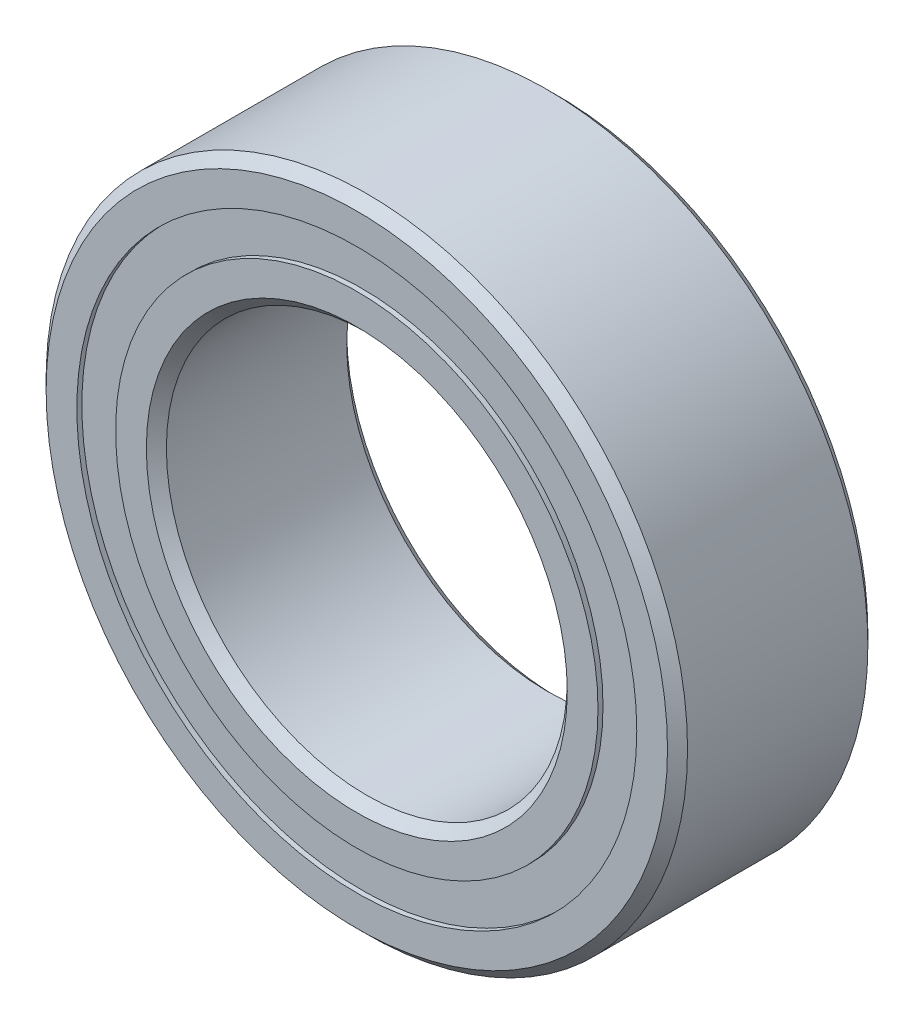
ISO-10303-21;
HEADER;
FILE_DESCRIPTION(('STEP AP214'),'2;1');
FILE_NAME('part.step','',(''),(''),'','','');
FILE_SCHEMA(('AUTOMOTIVE_DESIGN { 1 0 10303 214 1 1 1 1 }'));
ENDSEC;
DATA;
#1=APPLICATION_CONTEXT('core data for automotive mechanical design processes');
#2=APPLICATION_PROTOCOL_DEFINITION('international standard','automotive_design',2000,#1);
#3=PRODUCT_CONTEXT('',#1,'mechanical');
#4=PRODUCT('Part','Part','',(#3));
#5=PRODUCT_RELATED_PRODUCT_CATEGORY('part','',(#4));
#6=PRODUCT_DEFINITION_FORMATION('','',#4);
#7=PRODUCT_DEFINITION_CONTEXT('part definition',#1,'design');
#8=PRODUCT_DEFINITION('design','',#6,#7);
#9=PRODUCT_DEFINITION_SHAPE('','',#8);
#10=(LENGTH_UNIT() NAMED_UNIT(*) SI_UNIT(.MILLI.,.METRE.));
#11=(NAMED_UNIT(*) PLANE_ANGLE_UNIT() SI_UNIT($,.RADIAN.));
#12=(NAMED_UNIT(*) SI_UNIT($,.STERADIAN.) SOLID_ANGLE_UNIT());
#13=UNCERTAINTY_MEASURE_WITH_UNIT(LENGTH_MEASURE(1.E-05),#10,'distance_accuracy_value','');
#14=(GEOMETRIC_REPRESENTATION_CONTEXT(3) GLOBAL_UNCERTAINTY_ASSIGNED_CONTEXT((#13)) GLOBAL_UNIT_ASSIGNED_CONTEXT((#10,
#11,#12)) REPRESENTATION_CONTEXT('',''));
#15=CARTESIAN_POINT('',(0.,0.,0.));
#16=DIRECTION('',(0.,0.,1.));
#17=DIRECTION('',(1.,0.,0.));
#18=AXIS2_PLACEMENT_3D('',#15,#16,#17);
#19=CARTESIAN_POINT('',(0.,5.54322203296703,-1.884553));
#20=DIRECTION('',(0.,0.,1.));
#21=DIRECTION('',(1.,0.,0.));
#22=AXIS2_PLACEMENT_3D('',#19,#20,#21);
#23=PLANE('',#22);
#24=CARTESIAN_POINT('',(0.,0.,-1.884553));
#25=DIRECTION('',(0.,0.,1.));
#26=DIRECTION('',(1.,0.,0.));
#27=AXIS2_PLACEMENT_3D('',#24,#25,#26);
#28=CIRCLE('',#27,5.54322203296703);
#29=CARTESIAN_POINT('',(5.54322203296703,0.,-1.884553));
#30=VERTEX_POINT('',#29);
#31=EDGE_CURVE('E55',#30,#30,#28,.T.);
#32=ORIENTED_EDGE('',*,*,#31,.F.);
#33=EDGE_LOOP('',(#32));
#34=FACE_BOUND('',#33,.T.);
#35=CARTESIAN_POINT('',(0.,0.,-1.884553));
#36=DIRECTION('',(0.,0.,1.));
#37=DIRECTION('',(1.,0.,0.));
#38=AXIS2_PLACEMENT_3D('',#35,#36,#37);
#39=CIRCLE('',#38,4.77552796703297);
#40=CARTESIAN_POINT('',(4.77552796703297,0.,-1.884553));
#41=VERTEX_POINT('',#40);
#42=EDGE_CURVE('E11',#41,#41,#39,.T.);
#43=ORIENTED_EDGE('',*,*,#42,.T.);
#44=EDGE_LOOP('',(#43));
#45=FACE_BOUND('',#44,.T.);
#46=ADVANCED_FACE('F41',(#34,#45),#23,.F.);
#47=CARTESIAN_POINT('',(0.,0.,1.98374));
#48=DIRECTION('',(0.,0.,1.));
#49=DIRECTION('',(1.,0.,0.));
#50=AXIS2_PLACEMENT_3D('',#47,#48,#49);
#51=CYLINDRICAL_SURFACE('',#50,4.77552796703297);
#52=ORIENTED_EDGE('',*,*,#42,.F.);
#53=EDGE_LOOP('',(#52));
#54=FACE_BOUND('',#53,.T.);
#55=CARTESIAN_POINT('',(0.,0.,-0.961595974831125));
#56=DIRECTION('',(0.,0.,1.));
#57=DIRECTION('',(1.,0.,0.));
#58=AXIS2_PLACEMENT_3D('',#55,#56,#57);
#59=CIRCLE('',#58,4.77552796703297);
#60=CARTESIAN_POINT('',(4.77552796703297,0.,-0.961595974831125));
#61=VERTEX_POINT('',#60);
#62=EDGE_CURVE('E47',#61,#61,#59,.T.);
#63=ORIENTED_EDGE('',*,*,#62,.T.);
#64=EDGE_LOOP('',(#63));
#65=FACE_BOUND('',#64,.T.);
#66=ADVANCED_FACE('F64',(#54,#65),#51,.F.);
#67=CARTESIAN_POINT('',(0.,5.54322203296703,-0.961595974831125));
#68=DIRECTION('',(0.,0.,-1.));
#69=DIRECTION('',(-1.,0.,0.));
#70=AXIS2_PLACEMENT_3D('',#67,#68,#69);
#71=PLANE('',#70);
#72=ORIENTED_EDGE('',*,*,#62,.F.);
#73=EDGE_LOOP('',(#72));
#74=FACE_BOUND('',#73,.T.);
#75=CARTESIAN_POINT('',(0.,0.,-0.961595974831125));
#76=DIRECTION('',(0.,0.,1.));
#77=DIRECTION('',(1.,0.,0.));
#78=AXIS2_PLACEMENT_3D('',#75,#76,#77);
#79=CIRCLE('',#78,5.54322203296703);
#80=CARTESIAN_POINT('',(5.54322203296703,0.,-0.961595974831125));
#81=VERTEX_POINT('',#80);
#82=EDGE_CURVE('E51',#81,#81,#79,.T.);
#83=ORIENTED_EDGE('',*,*,#82,.T.);
#84=EDGE_LOOP('',(#83));
#85=FACE_BOUND('',#84,.T.);
#86=ADVANCED_FACE('F68',(#74,#85),#71,.F.);
#87=CARTESIAN_POINT('',(0.,0.,1.98374));
#88=DIRECTION('',(0.,0.,1.));
#89=DIRECTION('',(1.,0.,0.));
#90=AXIS2_PLACEMENT_3D('',#87,#88,#89);
#91=CYLINDRICAL_SURFACE('',#90,5.54322203296703);
#92=ORIENTED_EDGE('',*,*,#82,.F.);
#93=EDGE_LOOP('',(#92));
#94=FACE_BOUND('',#93,.T.);
#95=ORIENTED_EDGE('',*,*,#31,.T.);
#96=EDGE_LOOP('',(#95));
#97=FACE_BOUND('',#96,.T.);
#98=ADVANCED_FACE('F61',(#94,#97),#91,.T.);
#99=CLOSED_SHELL('',(#46,#66,#86,#98));
#100=MANIFOLD_SOLID_BREP('B2',#99);
#101=CARTESIAN_POINT('',(0.,5.54322203296703,1.884553));
#102=DIRECTION('',(0.,0.,-1.));
#103=DIRECTION('',(-1.,0.,0.));
#104=AXIS2_PLACEMENT_3D('',#101,#102,#103);
#105=PLANE('',#104);
#106=CARTESIAN_POINT('',(0.,0.,1.884553));
#107=DIRECTION('',(0.,0.,1.));
#108=DIRECTION('',(1.,0.,0.));
#109=AXIS2_PLACEMENT_3D('',#106,#107,#108);
#110=CIRCLE('',#109,4.77552796703297);
#111=CARTESIAN_POINT('',(4.77552796703297,0.,1.884553));
#112=VERTEX_POINT('',#111);
#113=EDGE_CURVE('E40',#112,#112,#110,.T.);
#114=ORIENTED_EDGE('',*,*,#113,.F.);
#115=EDGE_LOOP('',(#114));
#116=FACE_BOUND('',#115,.T.);
#117=CARTESIAN_POINT('',(0.,0.,1.884553));
#118=DIRECTION('',(0.,0.,1.));
#119=DIRECTION('',(1.,0.,0.));
#120=AXIS2_PLACEMENT_3D('',#117,#118,#119);
#121=CIRCLE('',#120,5.54322203296703);
#122=CARTESIAN_POINT('',(5.54322203296703,0.,1.884553));
#123=VERTEX_POINT('',#122);
#124=EDGE_CURVE('E122',#123,#123,#121,.T.);
#125=ORIENTED_EDGE('',*,*,#124,.T.);
#126=EDGE_LOOP('',(#125));
#127=FACE_BOUND('',#126,.T.);
#128=ADVANCED_FACE('F108',(#116,#127),#105,.F.);
#129=CARTESIAN_POINT('',(0.,0.,1.98374));
#130=DIRECTION('',(0.,0.,1.));
#131=DIRECTION('',(1.,0.,0.));
#132=AXIS2_PLACEMENT_3D('',#129,#130,#131);
#133=CYLINDRICAL_SURFACE('',#132,4.77552796703297);
#134=CARTESIAN_POINT('',(0.,0.,0.961595974831124));
#135=DIRECTION('',(0.,0.,1.));
#136=DIRECTION('',(1.,0.,0.));
#137=AXIS2_PLACEMENT_3D('',#134,#135,#136);
#138=CIRCLE('',#137,4.77552796703297);
#139=CARTESIAN_POINT('',(4.77552796703297,0.,0.961595974831124));
#140=VERTEX_POINT('',#139);
#141=EDGE_CURVE('E114',#140,#140,#138,.T.);
#142=ORIENTED_EDGE('',*,*,#141,.F.);
#143=EDGE_LOOP('',(#142));
#144=FACE_BOUND('',#143,.T.);
#145=ORIENTED_EDGE('',*,*,#113,.T.);
#146=EDGE_LOOP('',(#145));
#147=FACE_BOUND('',#146,.T.);
#148=ADVANCED_FACE('F137',(#144,#147),#133,.F.);
#149=CARTESIAN_POINT('',(0.,5.54322203296703,0.961595974831124));
#150=DIRECTION('',(0.,0.,1.));
#151=DIRECTION('',(1.,0.,0.));
#152=AXIS2_PLACEMENT_3D('',#149,#150,#151);
#153=PLANE('',#152);
#154=CARTESIAN_POINT('',(0.,0.,0.961595974831124));
#155=DIRECTION('',(0.,0.,1.));
#156=DIRECTION('',(1.,0.,0.));
#157=AXIS2_PLACEMENT_3D('',#154,#155,#156);
#158=CIRCLE('',#157,5.54322203296703);
#159=CARTESIAN_POINT('',(5.54322203296703,0.,0.961595974831124));
#160=VERTEX_POINT('',#159);
#161=EDGE_CURVE('E118',#160,#160,#158,.T.);
#162=ORIENTED_EDGE('',*,*,#161,.F.);
#163=EDGE_LOOP('',(#162));
#164=FACE_BOUND('',#163,.T.);
#165=ORIENTED_EDGE('',*,*,#141,.T.);
#166=EDGE_LOOP('',(#165));
#167=FACE_BOUND('',#166,.T.);
#168=ADVANCED_FACE('F132',(#164,#167),#153,.F.);
#169=CARTESIAN_POINT('',(0.,0.,1.98374));
#170=DIRECTION('',(0.,0.,1.));
#171=DIRECTION('',(1.,0.,0.));
#172=AXIS2_PLACEMENT_3D('',#169,#170,#171);
#173=CYLINDRICAL_SURFACE('',#172,5.54322203296703);
#174=ORIENTED_EDGE('',*,*,#124,.F.);
#175=EDGE_LOOP('',(#174));
#176=FACE_BOUND('',#175,.T.);
#177=ORIENTED_EDGE('',*,*,#161,.T.);
#178=EDGE_LOOP('',(#177));
#179=FACE_BOUND('',#178,.T.);
#180=ADVANCED_FACE('F129',(#176,#179),#173,.T.);
#181=CLOSED_SHELL('',(#128,#148,#168,#180));
#182=MANIFOLD_SOLID_BREP('B6',#181);
#183=CARTESIAN_POINT('',(-1.97440733385857,4.76664096305045,0.));
#184=DIRECTION('',(0.,0.,1.));
#185=DIRECTION('',(0.382683432365077,-0.923879532511292,0.));
#186=AXIS2_PLACEMENT_3D('',#183,#184,#185);
#187=SPHERICAL_SURFACE('',#186,0.961595974831125);
#188=CARTESIAN_POINT('',(-1.97440733385857,4.76664096305045,0.961595974831125));
#189=VERTEX_POINT('',#188);
#190=VERTEX_LOOP('',#189);
#191=FACE_BOUND('',#190,.T.);
#192=ADVANCED_FACE('F175',(#191),#187,.T.);
#193=CLOSED_SHELL('',(#192));
#194=MANIFOLD_SOLID_BREP('B35',#193);
#195=CARTESIAN_POINT('',(-3.6482290491843,3.64822904918439,0.));
#196=DIRECTION('',(0.,0.,1.));
#197=DIRECTION('',(0.707106781186539,-0.707106781186556,0.));
#198=AXIS2_PLACEMENT_3D('',#195,#196,#197);
#199=SPHERICAL_SURFACE('',#198,0.961595974831125);
#200=CARTESIAN_POINT('',(-3.6482290491843,3.64822904918439,0.961595974831125));
#201=VERTEX_POINT('',#200);
#202=VERTEX_LOOP('',#201);
#203=FACE_BOUND('',#202,.T.);
#204=ADVANCED_FACE('F195',(#203),#199,.T.);
#205=CLOSED_SHELL('',(#204));
#206=MANIFOLD_SOLID_BREP('B104',#205);
#207=CARTESIAN_POINT('',(-4.7666409630504,1.97440733385869,0.));
#208=DIRECTION('',(0.,0.,1.));
#209=DIRECTION('',(0.923879532511283,-0.3826834323651,0.));
#210=AXIS2_PLACEMENT_3D('',#207,#208,#209);
#211=SPHERICAL_SURFACE('',#210,0.961595974831125);
#212=CARTESIAN_POINT('',(-4.7666409630504,1.97440733385869,0.961595974831125));
#213=VERTEX_POINT('',#212);
#214=VERTEX_LOOP('',#213);
#215=FACE_BOUND('',#214,.T.);
#216=ADVANCED_FACE('F215',(#215),#211,.T.);
#217=CLOSED_SHELL('',(#216));
#218=MANIFOLD_SOLID_BREP('B171',#217);
#219=CARTESIAN_POINT('',(-5.159375,0.,0.));
#220=DIRECTION('',(0.,0.,1.));
#221=DIRECTION('',(1.,0.,0.));
#222=AXIS2_PLACEMENT_3D('',#219,#220,#221);
#223=SPHERICAL_SURFACE('',#222,0.961595974831125);
#224=CARTESIAN_POINT('',(-5.159375,0.,0.961595974831125));
#225=VERTEX_POINT('',#224);
#226=VERTEX_LOOP('',#225);
#227=FACE_BOUND('',#226,.T.);
#228=ADVANCED_FACE('F235',(#227),#223,.T.);
#229=CLOSED_SHELL('',(#228));
#230=MANIFOLD_SOLID_BREP('B191',#229);
#231=CARTESIAN_POINT('',(-4.76664096305044,-1.97440733385859,0.));
#232=DIRECTION('',(0.,0.,1.));
#233=DIRECTION('',(0.923879532511291,0.382683432365081,0.));
#234=AXIS2_PLACEMENT_3D('',#231,#232,#233);
#235=SPHERICAL_SURFACE('',#234,0.961595974831125);
#236=CARTESIAN_POINT('',(-4.76664096305044,-1.97440733385859,0.961595974831125));
#237=VERTEX_POINT('',#236);
#238=VERTEX_LOOP('',#237);
#239=FACE_BOUND('',#238,.T.);
#240=ADVANCED_FACE('F255',(#239),#235,.T.);
#241=CLOSED_SHELL('',(#240));
#242=MANIFOLD_SOLID_BREP('B211',#241);
#243=CARTESIAN_POINT('',(-3.64822904918437,-3.64822904918431,0.));
#244=DIRECTION('',(0.,0.,1.));
#245=DIRECTION('',(0.707106781186554,0.707106781186541,0.));
#246=AXIS2_PLACEMENT_3D('',#243,#244,#245);
#247=SPHERICAL_SURFACE('',#246,0.961595974831125);
#248=CARTESIAN_POINT('',(-3.64822904918437,-3.64822904918431,0.961595974831125));
#249=VERTEX_POINT('',#248);
#250=VERTEX_LOOP('',#249);
#251=FACE_BOUND('',#250,.T.);
#252=ADVANCED_FACE('F275',(#251),#247,.T.);
#253=CLOSED_SHELL('',(#252));
#254=MANIFOLD_SOLID_BREP('B231',#253);
#255=CARTESIAN_POINT('',(-1.97440733385867,-4.7666409630504,0.));
#256=DIRECTION('',(0.,0.,1.));
#257=DIRECTION('',(0.382683432365097,0.923879532511284,0.));
#258=AXIS2_PLACEMENT_3D('',#255,#256,#257);
#259=SPHERICAL_SURFACE('',#258,0.961595974831125);
#260=CARTESIAN_POINT('',(-1.97440733385867,-4.7666409630504,0.961595974831125));
#261=VERTEX_POINT('',#260);
#262=VERTEX_LOOP('',#261);
#263=FACE_BOUND('',#262,.T.);
#264=ADVANCED_FACE('F295',(#263),#259,.T.);
#265=CLOSED_SHELL('',(#264));
#266=MANIFOLD_SOLID_BREP('B251',#265);
#267=CARTESIAN_POINT('',(0.,-5.159375,0.));
#268=DIRECTION('',(0.,0.,1.));
#269=DIRECTION('',(0.,1.,0.));
#270=AXIS2_PLACEMENT_3D('',#267,#268,#269);
#271=SPHERICAL_SURFACE('',#270,0.961595974831125);
#272=CARTESIAN_POINT('',(0.,-5.159375,0.961595974831125));
#273=VERTEX_POINT('',#272);
#274=VERTEX_LOOP('',#273);
#275=FACE_BOUND('',#274,.T.);
#276=ADVANCED_FACE('F315',(#275),#271,.T.);
#277=CLOSED_SHELL('',(#276));
#278=MANIFOLD_SOLID_BREP('B271',#277);
#279=CARTESIAN_POINT('',(1.97440733385861,-4.76664096305043,0.));
#280=DIRECTION('',(0.,0.,1.));
#281=DIRECTION('',(-0.382683432365084,0.923879532511289,0.));
#282=AXIS2_PLACEMENT_3D('',#279,#280,#281);
#283=SPHERICAL_SURFACE('',#282,0.961595974831125);
#284=CARTESIAN_POINT('',(1.97440733385861,-4.76664096305043,0.961595974831125));
#285=VERTEX_POINT('',#284);
#286=VERTEX_LOOP('',#285);
#287=FACE_BOUND('',#286,.T.);
#288=ADVANCED_FACE('F335',(#287),#283,.T.);
#289=CLOSED_SHELL('',(#288));
#290=MANIFOLD_SOLID_BREP('B291',#289);
#291=CARTESIAN_POINT('',(3.64822904918432,-3.64822904918436,0.));
#292=DIRECTION('',(0.,0.,1.));
#293=DIRECTION('',(-0.707106781186544,0.707106781186551,0.));
#294=AXIS2_PLACEMENT_3D('',#291,#292,#293);
#295=SPHERICAL_SURFACE('',#294,0.961595974831125);
#296=CARTESIAN_POINT('',(3.64822904918432,-3.64822904918436,0.961595974831125));
#297=VERTEX_POINT('',#296);
#298=VERTEX_LOOP('',#297);
#299=FACE_BOUND('',#298,.T.);
#300=ADVANCED_FACE('F355',(#299),#295,.T.);
#301=CLOSED_SHELL('',(#300));
#302=MANIFOLD_SOLID_BREP('B311',#301);
#303=CARTESIAN_POINT('',(4.76664096305041,-1.97440733385866,0.));
#304=DIRECTION('',(0.,0.,1.));
#305=DIRECTION('',(-0.923879532511285,0.382683432365094,0.));
#306=AXIS2_PLACEMENT_3D('',#303,#304,#305);
#307=SPHERICAL_SURFACE('',#306,0.961595974831125);
#308=CARTESIAN_POINT('',(4.76664096305041,-1.97440733385866,0.961595974831125));
#309=VERTEX_POINT('',#308);
#310=VERTEX_LOOP('',#309);
#311=FACE_BOUND('',#310,.T.);
#312=ADVANCED_FACE('F375',(#311),#307,.T.);
#313=CLOSED_SHELL('',(#312));
#314=MANIFOLD_SOLID_BREP('B331',#313);
#315=CARTESIAN_POINT('',(5.159375,0.,0.));
#316=DIRECTION('',(0.,0.,1.));
#317=DIRECTION('',(-1.,0.,0.));
#318=AXIS2_PLACEMENT_3D('',#315,#316,#317);
#319=SPHERICAL_SURFACE('',#318,0.961595974831125);
#320=CARTESIAN_POINT('',(5.159375,0.,0.961595974831125));
#321=VERTEX_POINT('',#320);
#322=VERTEX_LOOP('',#321);
#323=FACE_BOUND('',#322,.T.);
#324=ADVANCED_FACE('F395',(#323),#319,.T.);
#325=CLOSED_SHELL('',(#324));
#326=MANIFOLD_SOLID_BREP('B351',#325);
#327=CARTESIAN_POINT('',(4.76664096305042,1.97440733385862,0.));
#328=DIRECTION('',(0.,0.,1.));
#329=DIRECTION('',(-0.923879532511288,-0.382683432365087,0.));
#330=AXIS2_PLACEMENT_3D('',#327,#328,#329);
#331=SPHERICAL_SURFACE('',#330,0.961595974831125);
#332=CARTESIAN_POINT('',(4.76664096305042,1.97440733385862,0.961595974831125));
#333=VERTEX_POINT('',#332);
#334=VERTEX_LOOP('',#333);
#335=FACE_BOUND('',#334,.T.);
#336=ADVANCED_FACE('F415',(#335),#331,.T.);
#337=CLOSED_SHELL('',(#336));
#338=MANIFOLD_SOLID_BREP('B371',#337);
#339=CARTESIAN_POINT('',(3.64822904918435,3.64822904918434,0.));
#340=DIRECTION('',(0.,0.,1.));
#341=DIRECTION('',(-0.707106781186549,-0.707106781186546,0.));
#342=AXIS2_PLACEMENT_3D('',#339,#340,#341);
#343=SPHERICAL_SURFACE('',#342,0.961595974831125);
#344=CARTESIAN_POINT('',(3.64822904918435,3.64822904918434,0.961595974831125));
#345=VERTEX_POINT('',#344);
#346=VERTEX_LOOP('',#345);
#347=FACE_BOUND('',#346,.T.);
#348=ADVANCED_FACE('F435',(#347),#343,.T.);
#349=CLOSED_SHELL('',(#348));
#350=MANIFOLD_SOLID_BREP('B391',#349);
#351=CARTESIAN_POINT('',(1.97440733385864,4.76664096305042,0.));
#352=DIRECTION('',(0.,0.,1.));
#353=DIRECTION('',(-0.382683432365091,-0.923879532511287,0.));
#354=AXIS2_PLACEMENT_3D('',#351,#352,#353);
#355=SPHERICAL_SURFACE('',#354,0.961595974831125);
#356=CARTESIAN_POINT('',(1.97440733385864,4.76664096305042,0.961595974831125));
#357=VERTEX_POINT('',#356);
#358=VERTEX_LOOP('',#357);
#359=FACE_BOUND('',#358,.T.);
#360=ADVANCED_FACE('F455',(#359),#355,.T.);
#361=CLOSED_SHELL('',(#360));
#362=MANIFOLD_SOLID_BREP('B411',#361);
#363=CARTESIAN_POINT('',(0.,5.159375,0.));
#364=DIRECTION('',(0.,0.,1.));
#365=DIRECTION('',(0.,-1.,0.));
#366=AXIS2_PLACEMENT_3D('',#363,#364,#365);
#367=SPHERICAL_SURFACE('',#366,0.961595974831125);
#368=CARTESIAN_POINT('',(0.,5.159375,0.961595974831125));
#369=VERTEX_POINT('',#368);
#370=VERTEX_LOOP('',#369);
#371=FACE_BOUND('',#370,.T.);
#372=ADVANCED_FACE('F477',(#371),#367,.T.);
#373=CLOSED_SHELL('',(#372));
#374=MANIFOLD_SOLID_BREP('B431',#373);
#375=CARTESIAN_POINT('',(0.,4.77552796703297,1.98374));
#376=DIRECTION('',(0.,0.,-1.));
#377=DIRECTION('',(-1.,0.,0.));
#378=AXIS2_PLACEMENT_3D('',#375,#376,#377);
#379=PLANE('',#378);
#380=CARTESIAN_POINT('',(0.,0.,1.98374));
#381=DIRECTION('',(0.,0.,1.));
#382=DIRECTION('',(1.,0.,0.));
#383=AXIS2_PLACEMENT_3D('',#380,#381,#382);
#384=CIRCLE('',#383,4.167124);
#385=CARTESIAN_POINT('',(4.167124,0.,1.98374));
#386=VERTEX_POINT('',#385);
#387=EDGE_CURVE('E524',#386,#386,#384,.T.);
#388=ORIENTED_EDGE('',*,*,#387,.F.);
#389=EDGE_LOOP('',(#388));
#390=FACE_BOUND('',#389,.T.);
#391=CARTESIAN_POINT('',(0.,0.,1.98374));
#392=DIRECTION('',(0.,0.,1.));
#393=DIRECTION('',(1.,0.,0.));
#394=AXIS2_PLACEMENT_3D('',#391,#392,#393);
#395=CIRCLE('',#394,4.77552796703297);
#396=CARTESIAN_POINT('',(4.77552796703297,0.,1.98374));
#397=VERTEX_POINT('',#396);
#398=EDGE_CURVE('E476',#397,#397,#395,.T.);
#399=ORIENTED_EDGE('',*,*,#398,.T.);
#400=EDGE_LOOP('',(#399));
#401=FACE_BOUND('',#400,.T.);
#402=ADVANCED_FACE('F496',(#390,#401),#379,.F.);
#403=CARTESIAN_POINT('',(0.,0.,1.98374));
#404=DIRECTION('',(0.,0.,1.));
#405=DIRECTION('',(1.,0.,0.));
#406=AXIS2_PLACEMENT_3D('',#403,#404,#405);
#407=CYLINDRICAL_SURFACE('',#406,4.77552796703297);
#408=ORIENTED_EDGE('',*,*,#398,.F.);
#409=EDGE_LOOP('',(#408));
#410=FACE_BOUND('',#409,.T.);
#411=CARTESIAN_POINT('',(0.,0.,0.881662222222222));
#412=DIRECTION('',(0.,0.,1.));
#413=DIRECTION('',(1.,0.,0.));
#414=AXIS2_PLACEMENT_3D('',#411,#412,#413);
#415=CIRCLE('',#414,4.77552796703297);
#416=CARTESIAN_POINT('',(4.77552796703297,0.,0.881662222222222));
#417=VERTEX_POINT('',#416);
#418=EDGE_CURVE('E502',#417,#417,#415,.T.);
#419=ORIENTED_EDGE('',*,*,#418,.T.);
#420=EDGE_LOOP('',(#419));
#421=FACE_BOUND('',#420,.T.);
#422=ADVANCED_FACE('F531',(#410,#421),#407,.T.);
#423=CARTESIAN_POINT('',(0.,0.,0.));
#424=DIRECTION('',(0.,0.,1.));
#425=DIRECTION('',(1.,0.,0.));
#426=AXIS2_PLACEMENT_3D('',#423,#424,#425);
#427=TOROIDAL_SURFACE('',#426,5.15937499999999,0.961595974831123);
#428=ORIENTED_EDGE('',*,*,#418,.F.);
#429=EDGE_LOOP('',(#428));
#430=FACE_BOUND('',#429,.T.);
#431=CARTESIAN_POINT('',(0.,0.,-0.881662222222224));
#432=DIRECTION('',(0.,0.,1.));
#433=DIRECTION('',(1.,0.,0.));
#434=AXIS2_PLACEMENT_3D('',#431,#432,#433);
#435=CIRCLE('',#434,4.77552796703297);
#436=CARTESIAN_POINT('',(4.77552796703297,0.,-0.881662222222224));
#437=VERTEX_POINT('',#436);
#438=EDGE_CURVE('E506',#437,#437,#435,.T.);
#439=ORIENTED_EDGE('',*,*,#438,.T.);
#440=EDGE_LOOP('',(#439));
#441=FACE_BOUND('',#440,.T.);
#442=ADVANCED_FACE('F535',(#430,#441),#427,.F.);
#443=CARTESIAN_POINT('',(0.,0.,1.98374));
#444=DIRECTION('',(0.,0.,1.));
#445=DIRECTION('',(1.,0.,0.));
#446=AXIS2_PLACEMENT_3D('',#443,#444,#445);
#447=CYLINDRICAL_SURFACE('',#446,4.77552796703297);
#448=ORIENTED_EDGE('',*,*,#438,.F.);
#449=EDGE_LOOP('',(#448));
#450=FACE_BOUND('',#449,.T.);
#451=CARTESIAN_POINT('',(0.,0.,-1.98374));
#452=DIRECTION('',(0.,0.,1.));
#453=DIRECTION('',(1.,0.,0.));
#454=AXIS2_PLACEMENT_3D('',#451,#452,#453);
#455=CIRCLE('',#454,4.77552796703297);
#456=CARTESIAN_POINT('',(4.77552796703297,0.,-1.98374));
#457=VERTEX_POINT('',#456);
#458=EDGE_CURVE('E510',#457,#457,#455,.T.);
#459=ORIENTED_EDGE('',*,*,#458,.T.);
#460=EDGE_LOOP('',(#459));
#461=FACE_BOUND('',#460,.T.);
#462=ADVANCED_FACE('F540',(#450,#461),#447,.T.);
#463=CARTESIAN_POINT('',(0.,4.167124,-1.98374));
#464=DIRECTION('',(0.,0.,1.));
#465=DIRECTION('',(1.,0.,0.));
#466=AXIS2_PLACEMENT_3D('',#463,#464,#465);
#467=PLANE('',#466);
#468=ORIENTED_EDGE('',*,*,#458,.F.);
#469=EDGE_LOOP('',(#468));
#470=FACE_BOUND('',#469,.T.);
#471=CARTESIAN_POINT('',(0.,0.,-1.98374));
#472=DIRECTION('',(0.,0.,1.));
#473=DIRECTION('',(1.,0.,0.));
#474=AXIS2_PLACEMENT_3D('',#471,#472,#473);
#475=CIRCLE('',#474,4.167124);
#476=CARTESIAN_POINT('',(4.167124,0.,-1.98374));
#477=VERTEX_POINT('',#476);
#478=EDGE_CURVE('E515',#477,#477,#475,.T.);
#479=ORIENTED_EDGE('',*,*,#478,.T.);
#480=EDGE_LOOP('',(#479));
#481=FACE_BOUND('',#480,.T.);
#482=ADVANCED_FACE('F546',(#470,#481),#467,.F.);
#483=CARTESIAN_POINT('',(0.,0.,-1.785366));
#484=DIRECTION('',(0.,0.,-1.));
#485=DIRECTION('',(-1.,0.,0.));
#486=AXIS2_PLACEMENT_3D('',#483,#484,#485);
#487=CONICAL_SURFACE('',#486,3.96875,0.785398163397448);
#488=ORIENTED_EDGE('',*,*,#478,.F.);
#489=EDGE_LOOP('',(#488));
#490=FACE_BOUND('',#489,.T.);
#491=CARTESIAN_POINT('',(0.,0.,-1.785366));
#492=DIRECTION('',(0.,0.,1.));
#493=DIRECTION('',(1.,0.,0.));
#494=AXIS2_PLACEMENT_3D('',#491,#492,#493);
#495=CIRCLE('',#494,3.96875);
#496=CARTESIAN_POINT('',(3.96875,0.,-1.785366));
#497=VERTEX_POINT('',#496);
#498=EDGE_CURVE('E518',#497,#497,#495,.T.);
#499=ORIENTED_EDGE('',*,*,#498,.T.);
#500=EDGE_LOOP('',(#499));
#501=FACE_BOUND('',#500,.T.);
#502=ADVANCED_FACE('F550',(#490,#501),#487,.F.);
#503=CARTESIAN_POINT('',(0.,0.,1.98374));
#504=DIRECTION('',(0.,0.,1.));
#505=DIRECTION('',(1.,0.,0.));
#506=AXIS2_PLACEMENT_3D('',#503,#504,#505);
#507=CYLINDRICAL_SURFACE('',#506,3.96875);
#508=ORIENTED_EDGE('',*,*,#498,.F.);
#509=EDGE_LOOP('',(#508));
#510=FACE_BOUND('',#509,.T.);
#511=CARTESIAN_POINT('',(0.,0.,1.785366));
#512=DIRECTION('',(0.,0.,1.));
#513=DIRECTION('',(1.,0.,0.));
#514=AXIS2_PLACEMENT_3D('',#511,#512,#513);
#515=CIRCLE('',#514,3.96875);
#516=CARTESIAN_POINT('',(3.96875,0.,1.785366));
#517=VERTEX_POINT('',#516);
#518=EDGE_CURVE('E521',#517,#517,#515,.T.);
#519=ORIENTED_EDGE('',*,*,#518,.T.);
#520=EDGE_LOOP('',(#519));
#521=FACE_BOUND('',#520,.T.);
#522=ADVANCED_FACE('F554',(#510,#521),#507,.F.);
#523=CARTESIAN_POINT('',(0.,0.,1.98374));
#524=DIRECTION('',(0.,0.,1.));
#525=DIRECTION('',(1.,0.,0.));
#526=AXIS2_PLACEMENT_3D('',#523,#524,#525);
#527=CONICAL_SURFACE('',#526,4.167124,0.785398163397449);
#528=ORIENTED_EDGE('',*,*,#518,.F.);
#529=EDGE_LOOP('',(#528));
#530=FACE_BOUND('',#529,.T.);
#531=ORIENTED_EDGE('',*,*,#387,.T.);
#532=EDGE_LOOP('',(#531));
#533=FACE_BOUND('',#532,.T.);
#534=ADVANCED_FACE('F528',(#530,#533),#527,.F.);
#535=CLOSED_SHELL('',(#402,#422,#442,#462,#482,#502,#522,#534));
#536=MANIFOLD_SOLID_BREP('B451',#535);
#537=CARTESIAN_POINT('',(0.,0.,1.785366));
#538=DIRECTION('',(0.,0.,-1.));
#539=DIRECTION('',(-1.,0.,0.));
#540=AXIS2_PLACEMENT_3D('',#537,#538,#539);
#541=CONICAL_SURFACE('',#540,6.35,0.785398163397449);
#542=CARTESIAN_POINT('',(0.,0.,1.98374));
#543=DIRECTION('',(0.,0.,1.));
#544=DIRECTION('',(1.,0.,0.));
#545=AXIS2_PLACEMENT_3D('',#542,#543,#544);
#546=CIRCLE('',#545,6.151626);
#547=CARTESIAN_POINT('',(6.151626,0.,1.98374));
#548=VERTEX_POINT('',#547);
#549=EDGE_CURVE('E645',#548,#548,#546,.T.);
#550=ORIENTED_EDGE('',*,*,#549,.F.);
#551=EDGE_LOOP('',(#550));
#552=FACE_BOUND('',#551,.T.);
#553=CARTESIAN_POINT('',(0.,0.,1.785366));
#554=DIRECTION('',(0.,0.,1.));
#555=DIRECTION('',(1.,0.,0.));
#556=AXIS2_PLACEMENT_3D('',#553,#554,#555);
#557=CIRCLE('',#556,6.35);
#558=CARTESIAN_POINT('',(6.35,0.,1.785366));
#559=VERTEX_POINT('',#558);
#560=EDGE_CURVE('E495',#559,#559,#557,.T.);
#561=ORIENTED_EDGE('',*,*,#560,.T.);
#562=EDGE_LOOP('',(#561));
#563=FACE_BOUND('',#562,.T.);
#564=ADVANCED_FACE('F617',(#552,#563),#541,.T.);
#565=CARTESIAN_POINT('',(0.,0.,1.98374));
#566=DIRECTION('',(0.,0.,1.));
#567=DIRECTION('',(1.,0.,0.));
#568=AXIS2_PLACEMENT_3D('',#565,#566,#567);
#569=CYLINDRICAL_SURFACE('',#568,6.35);
#570=ORIENTED_EDGE('',*,*,#560,.F.);
#571=EDGE_LOOP('',(#570));
#572=FACE_BOUND('',#571,.T.);
#573=CARTESIAN_POINT('',(0.,0.,-1.785366));
#574=DIRECTION('',(0.,0.,1.));
#575=DIRECTION('',(1.,0.,0.));
#576=AXIS2_PLACEMENT_3D('',#573,#574,#575);
#577=CIRCLE('',#576,6.35);
#578=CARTESIAN_POINT('',(6.35,0.,-1.785366));
#579=VERTEX_POINT('',#578);
#580=EDGE_CURVE('E623',#579,#579,#577,.T.);
#581=ORIENTED_EDGE('',*,*,#580,.T.);
#582=EDGE_LOOP('',(#581));
#583=FACE_BOUND('',#582,.T.);
#584=ADVANCED_FACE('F652',(#572,#583),#569,.T.);
#585=CARTESIAN_POINT('',(0.,0.,-1.98374));
#586=DIRECTION('',(0.,0.,1.));
#587=DIRECTION('',(1.,0.,0.));
#588=AXIS2_PLACEMENT_3D('',#585,#586,#587);
#589=CONICAL_SURFACE('',#588,6.151626,0.785398163397448);
#590=ORIENTED_EDGE('',*,*,#580,.F.);
#591=EDGE_LOOP('',(#590));
#592=FACE_BOUND('',#591,.T.);
#593=CARTESIAN_POINT('',(0.,0.,-1.98374));
#594=DIRECTION('',(0.,0.,1.));
#595=DIRECTION('',(1.,0.,0.));
#596=AXIS2_PLACEMENT_3D('',#593,#594,#595);
#597=CIRCLE('',#596,6.151626);
#598=CARTESIAN_POINT('',(6.151626,0.,-1.98374));
#599=VERTEX_POINT('',#598);
#600=EDGE_CURVE('E627',#599,#599,#597,.T.);
#601=ORIENTED_EDGE('',*,*,#600,.T.);
#602=EDGE_LOOP('',(#601));
#603=FACE_BOUND('',#602,.T.);
#604=ADVANCED_FACE('F656',(#592,#603),#589,.T.);
#605=CARTESIAN_POINT('',(0.,6.151626,-1.98374));
#606=DIRECTION('',(0.,0.,1.));
#607=DIRECTION('',(1.,0.,0.));
#608=AXIS2_PLACEMENT_3D('',#605,#606,#607);
#609=PLANE('',#608);
#610=ORIENTED_EDGE('',*,*,#600,.F.);
#611=EDGE_LOOP('',(#610));
#612=FACE_BOUND('',#611,.T.);
#613=CARTESIAN_POINT('',(0.,0.,-1.98374));
#614=DIRECTION('',(0.,0.,1.));
#615=DIRECTION('',(1.,0.,0.));
#616=AXIS2_PLACEMENT_3D('',#613,#614,#615);
#617=CIRCLE('',#616,5.54322203296703);
#618=CARTESIAN_POINT('',(5.54322203296703,0.,-1.98374));
#619=VERTEX_POINT('',#618);
#620=EDGE_CURVE('E631',#619,#619,#617,.T.);
#621=ORIENTED_EDGE('',*,*,#620,.T.);
#622=EDGE_LOOP('',(#621));
#623=FACE_BOUND('',#622,.T.);
#624=ADVANCED_FACE('F661',(#612,#623),#609,.F.);
#625=CARTESIAN_POINT('',(0.,0.,1.98374));
#626=DIRECTION('',(0.,0.,1.));
#627=DIRECTION('',(1.,0.,0.));
#628=AXIS2_PLACEMENT_3D('',#625,#626,#627);
#629=CYLINDRICAL_SURFACE('',#628,5.54322203296703);
#630=ORIENTED_EDGE('',*,*,#620,.F.);
#631=EDGE_LOOP('',(#630));
#632=FACE_BOUND('',#631,.T.);
#633=CARTESIAN_POINT('',(0.,0.,-0.881662222222222));
#634=DIRECTION('',(0.,0.,1.));
#635=DIRECTION('',(1.,0.,0.));
#636=AXIS2_PLACEMENT_3D('',#633,#634,#635);
#637=CIRCLE('',#636,5.54322203296703);
#638=CARTESIAN_POINT('',(5.54322203296703,0.,-0.881662222222222));
#639=VERTEX_POINT('',#638);
#640=EDGE_CURVE('E636',#639,#639,#637,.T.);
#641=ORIENTED_EDGE('',*,*,#640,.T.);
#642=EDGE_LOOP('',(#641));
#643=FACE_BOUND('',#642,.T.);
#644=ADVANCED_FACE('F667',(#632,#643),#629,.F.);
#645=CARTESIAN_POINT('',(0.,0.,0.));
#646=DIRECTION('',(0.,0.,1.));
#647=DIRECTION('',(1.,0.,0.));
#648=AXIS2_PLACEMENT_3D('',#645,#646,#647);
#649=TOROIDAL_SURFACE('',#648,5.159375,0.961595974831125);
#650=ORIENTED_EDGE('',*,*,#640,.F.);
#651=EDGE_LOOP('',(#650));
#652=FACE_BOUND('',#651,.T.);
#653=CARTESIAN_POINT('',(0.,0.,0.881662222222222));
#654=DIRECTION('',(0.,0.,1.));
#655=DIRECTION('',(1.,0.,0.));
#656=AXIS2_PLACEMENT_3D('',#653,#654,#655);
#657=CIRCLE('',#656,5.54322203296703);
#658=CARTESIAN_POINT('',(5.54322203296703,0.,0.881662222222222));
#659=VERTEX_POINT('',#658);
#660=EDGE_CURVE('E639',#659,#659,#657,.T.);
#661=ORIENTED_EDGE('',*,*,#660,.T.);
#662=EDGE_LOOP('',(#661));
#663=FACE_BOUND('',#662,.T.);
#664=ADVANCED_FACE('F671',(#652,#663),#649,.F.);
#665=CARTESIAN_POINT('',(0.,0.,1.98374));
#666=DIRECTION('',(0.,0.,1.));
#667=DIRECTION('',(1.,0.,0.));
#668=AXIS2_PLACEMENT_3D('',#665,#666,#667);
#669=CYLINDRICAL_SURFACE('',#668,5.54322203296703);
#670=ORIENTED_EDGE('',*,*,#660,.F.);
#671=EDGE_LOOP('',(#670));
#672=FACE_BOUND('',#671,.T.);
#673=CARTESIAN_POINT('',(0.,0.,1.98374));
#674=DIRECTION('',(0.,0.,1.));
#675=DIRECTION('',(1.,0.,0.));
#676=AXIS2_PLACEMENT_3D('',#673,#674,#675);
#677=CIRCLE('',#676,5.54322203296703);
#678=CARTESIAN_POINT('',(5.54322203296703,0.,1.98374));
#679=VERTEX_POINT('',#678);
#680=EDGE_CURVE('E642',#679,#679,#677,.T.);
#681=ORIENTED_EDGE('',*,*,#680,.T.);
#682=EDGE_LOOP('',(#681));
#683=FACE_BOUND('',#682,.T.);
#684=ADVANCED_FACE('F675',(#672,#683),#669,.F.);
#685=CARTESIAN_POINT('',(0.,6.151626,1.98374));
#686=DIRECTION('',(0.,0.,-1.));
#687=DIRECTION('',(-1.,0.,0.));
#688=AXIS2_PLACEMENT_3D('',#685,#686,#687);
#689=PLANE('',#688);
#690=ORIENTED_EDGE('',*,*,#680,.F.);
#691=EDGE_LOOP('',(#690));
#692=FACE_BOUND('',#691,.T.);
#693=ORIENTED_EDGE('',*,*,#549,.T.);
#694=EDGE_LOOP('',(#693));
#695=FACE_BOUND('',#694,.T.);
#696=ADVANCED_FACE('F649',(#692,#695),#689,.F.);
#697=CLOSED_SHELL('',(#564,#584,#604,#624,#644,#664,#684,#696));
#698=MANIFOLD_SOLID_BREP('B471',#697);
#699=ADVANCED_BREP_SHAPE_REPRESENTATION('',(#18,#100,#182,#194,#206,#218,#230,#242,#254,#266,
#278,#290,#302,#314,#326,#338,#350,#362,#374,#536,#698),#14);
#700=SHAPE_DEFINITION_REPRESENTATION(#9,#699);
ENDSEC;
END-ISO-10303-21;
